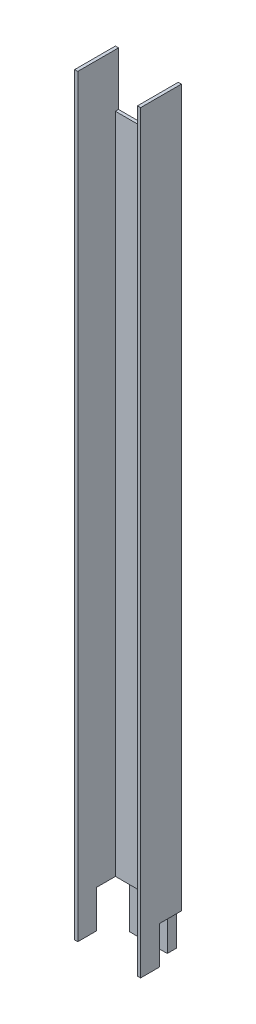
ISO-10303-21;
HEADER;
FILE_DESCRIPTION(('STEP AP214'),'2;1');
FILE_NAME('part.step','',(''),(''),'','','');
FILE_SCHEMA(('AUTOMOTIVE_DESIGN { 1 0 10303 214 1 1 1 1 }'));
ENDSEC;
DATA;
#1=APPLICATION_CONTEXT('core data for automotive mechanical design processes');
#2=APPLICATION_PROTOCOL_DEFINITION('international standard','automotive_design',2000,#1);
#3=PRODUCT_CONTEXT('',#1,'mechanical');
#4=PRODUCT('Part','Part','',(#3));
#5=PRODUCT_RELATED_PRODUCT_CATEGORY('part','',(#4));
#6=PRODUCT_DEFINITION_FORMATION('','',#4);
#7=PRODUCT_DEFINITION_CONTEXT('part definition',#1,'design');
#8=PRODUCT_DEFINITION('design','',#6,#7);
#9=PRODUCT_DEFINITION_SHAPE('','',#8);
#10=(LENGTH_UNIT() NAMED_UNIT(*) SI_UNIT(.MILLI.,.METRE.));
#11=(NAMED_UNIT(*) PLANE_ANGLE_UNIT() SI_UNIT($,.RADIAN.));
#12=(NAMED_UNIT(*) SI_UNIT($,.STERADIAN.) SOLID_ANGLE_UNIT());
#13=UNCERTAINTY_MEASURE_WITH_UNIT(LENGTH_MEASURE(1.E-05),#10,'distance_accuracy_value','');
#14=(GEOMETRIC_REPRESENTATION_CONTEXT(3) GLOBAL_UNCERTAINTY_ASSIGNED_CONTEXT((#13)) GLOBAL_UNIT_ASSIGNED_CONTEXT((#10,
#11,#12)) REPRESENTATION_CONTEXT('',''));
#15=CARTESIAN_POINT('',(0.,0.,0.));
#16=DIRECTION('',(0.,0.,1.));
#17=DIRECTION('',(1.,0.,0.));
#18=AXIS2_PLACEMENT_3D('',#15,#16,#17);
#19=CARTESIAN_POINT('',(0.,0.,0.));
#20=DIRECTION('',(0.,-1.,0.));
#21=DIRECTION('',(0.,0.,-1.));
#22=AXIS2_PLACEMENT_3D('',#19,#20,#21);
#23=PLANE('',#22);
#24=DIRECTION('',(0.,0.,1.));
#25=VECTOR('',#24,1.);
#26=CARTESIAN_POINT('',(9.5,0.,6.5));
#27=LINE('',#26,#25);
#28=CARTESIAN_POINT('',(9.50000000000001,0.,0.500000000000001));
#29=VERTEX_POINT('',#28);
#30=CARTESIAN_POINT('',(9.5,0.,6.5));
#31=VERTEX_POINT('',#30);
#32=EDGE_CURVE('E160',#29,#31,#27,.T.);
#33=ORIENTED_EDGE('',*,*,#32,.F.);
#34=DIRECTION('',(1.,0.,0.));
#35=VECTOR('',#34,1.);
#36=CARTESIAN_POINT('',(-19.5,0.,0.500000000000001));
#37=LINE('',#36,#35);
#38=CARTESIAN_POINT('',(10.5,0.,0.500000000000001));
#39=VERTEX_POINT('',#38);
#40=EDGE_CURVE('E218',#29,#39,#37,.T.);
#41=ORIENTED_EDGE('',*,*,#40,.T.);
#42=DIRECTION('',(0.,0.,-1.));
#43=VECTOR('',#42,1.);
#44=CARTESIAN_POINT('',(10.5,0.,-6.5));
#45=LINE('',#44,#43);
#46=CARTESIAN_POINT('',(10.5,0.,6.5));
#47=VERTEX_POINT('',#46);
#48=EDGE_CURVE('E148',#47,#39,#45,.T.);
#49=ORIENTED_EDGE('',*,*,#48,.F.);
#50=DIRECTION('',(1.,0.,0.));
#51=VECTOR('',#50,1.);
#52=CARTESIAN_POINT('',(10.5,0.,6.5));
#53=LINE('',#52,#51);
#54=EDGE_CURVE('E85',#31,#47,#53,.T.);
#55=ORIENTED_EDGE('',*,*,#54,.F.);
#56=EDGE_LOOP('',(#33,#41,#49,#55));
#57=FACE_BOUND('',#56,.T.);
#58=ADVANCED_FACE('F39',(#57),#23,.T.);
#59=DIRECTION('',(0.,0.,1.));
#60=VECTOR('',#59,1.);
#61=CARTESIAN_POINT('',(-10.5,0.,6.5));
#62=LINE('',#61,#60);
#63=CARTESIAN_POINT('',(-10.5,0.,0.500000000000001));
#64=VERTEX_POINT('',#63);
#65=CARTESIAN_POINT('',(-10.5,0.,6.5));
#66=VERTEX_POINT('',#65);
#67=EDGE_CURVE('E152',#64,#66,#62,.T.);
#68=ORIENTED_EDGE('',*,*,#67,.F.);
#69=CARTESIAN_POINT('',(-9.5,0.,0.500000000000001));
#70=VERTEX_POINT('',#69);
#71=EDGE_CURVE('E216',#64,#70,#37,.T.);
#72=ORIENTED_EDGE('',*,*,#71,.T.);
#73=DIRECTION('',(0.,0.,-1.));
#74=VECTOR('',#73,1.);
#75=CARTESIAN_POINT('',(-9.5,0.,-5.5));
#76=LINE('',#75,#74);
#77=CARTESIAN_POINT('',(-9.5,0.,6.5));
#78=VERTEX_POINT('',#77);
#79=EDGE_CURVE('E157',#78,#70,#76,.T.);
#80=ORIENTED_EDGE('',*,*,#79,.F.);
#81=DIRECTION('',(1.,0.,0.));
#82=VECTOR('',#81,1.);
#83=CARTESIAN_POINT('',(-9.5,0.,6.5));
#84=LINE('',#83,#82);
#85=EDGE_CURVE('E124',#66,#78,#84,.T.);
#86=ORIENTED_EDGE('',*,*,#85,.F.);
#87=EDGE_LOOP('',(#68,#72,#80,#86));
#88=FACE_BOUND('',#87,.T.);
#89=ADVANCED_FACE('F354',(#88),#23,.T.);
#90=CARTESIAN_POINT('',(-10.5,240.,-6.5));
#91=DIRECTION('',(0.,0.,1.));
#92=DIRECTION('',(1.,0.,0.));
#93=AXIS2_PLACEMENT_3D('',#90,#91,#92);
#94=PLANE('',#93);
#95=DIRECTION('',(0.,-1.,0.));
#96=VECTOR('',#95,1.);
#97=CARTESIAN_POINT('',(10.5,240.,-6.5));
#98=LINE('',#97,#96);
#99=CARTESIAN_POINT('',(10.5,240.,-6.5));
#100=VERTEX_POINT('',#99);
#101=CARTESIAN_POINT('',(10.5,12.,-6.5));
#102=VERTEX_POINT('',#101);
#103=EDGE_CURVE('E48',#100,#102,#98,.T.);
#104=ORIENTED_EDGE('',*,*,#103,.T.);
#105=DIRECTION('',(1.,0.,0.));
#106=VECTOR('',#105,1.);
#107=CARTESIAN_POINT('',(-19.5,12.,-6.5));
#108=LINE('',#107,#106);
#109=CARTESIAN_POINT('',(5.99999999999999,12.,-6.5));
#110=VERTEX_POINT('',#109);
#111=EDGE_CURVE('E191',#110,#102,#108,.T.);
#112=ORIENTED_EDGE('',*,*,#111,.F.);
#113=DIRECTION('',(0.,-1.,0.));
#114=VECTOR('',#113,1.);
#115=CARTESIAN_POINT('',(6.,41.,-6.5));
#116=LINE('',#115,#114);
#117=CARTESIAN_POINT('',(6.,41.,-6.5));
#118=VERTEX_POINT('',#117);
#119=EDGE_CURVE('E275',#118,#110,#116,.T.);
#120=ORIENTED_EDGE('',*,*,#119,.F.);
#121=DIRECTION('',(1.,0.,0.));
#122=VECTOR('',#121,1.);
#123=CARTESIAN_POINT('',(6.,41.,-6.5));
#124=LINE('',#123,#122);
#125=CARTESIAN_POINT('',(-5.99999999999999,41.,-6.5));
#126=VERTEX_POINT('',#125);
#127=EDGE_CURVE('E287',#126,#118,#124,.T.);
#128=ORIENTED_EDGE('',*,*,#127,.F.);
#129=DIRECTION('',(0.,1.,0.));
#130=VECTOR('',#129,1.);
#131=CARTESIAN_POINT('',(-5.99999999999999,41.,-6.5));
#132=LINE('',#131,#130);
#133=CARTESIAN_POINT('',(-5.99999999999999,12.,-6.5));
#134=VERTEX_POINT('',#133);
#135=EDGE_CURVE('E55',#134,#126,#132,.T.);
#136=ORIENTED_EDGE('',*,*,#135,.F.);
#137=CARTESIAN_POINT('',(-10.5,12.,-6.5));
#138=VERTEX_POINT('',#137);
#139=EDGE_CURVE('E217',#138,#134,#108,.T.);
#140=ORIENTED_EDGE('',*,*,#139,.F.);
#141=DIRECTION('',(0.,-1.,0.));
#142=VECTOR('',#141,1.);
#143=CARTESIAN_POINT('',(-10.5,240.,-6.5));
#144=LINE('',#143,#142);
#145=CARTESIAN_POINT('',(-10.5,240.,-6.5));
#146=VERTEX_POINT('',#145);
#147=EDGE_CURVE('E180',#146,#138,#144,.T.);
#148=ORIENTED_EDGE('',*,*,#147,.F.);
#149=DIRECTION('',(-1.,0.,0.));
#150=VECTOR('',#149,1.);
#151=CARTESIAN_POINT('',(-10.5,240.,-6.5));
#152=LINE('',#151,#150);
#153=CARTESIAN_POINT('',(-9.5,240.,-6.5));
#154=VERTEX_POINT('',#153);
#155=EDGE_CURVE('E323',#154,#146,#152,.T.);
#156=ORIENTED_EDGE('',*,*,#155,.F.);
#157=DIRECTION('',(0.,1.,0.));
#158=VECTOR('',#157,1.);
#159=CARTESIAN_POINT('',(-9.5,223.,-6.5));
#160=LINE('',#159,#158);
#161=CARTESIAN_POINT('',(-9.5,223.,-6.5));
#162=VERTEX_POINT('',#161);
#163=EDGE_CURVE('E136',#162,#154,#160,.T.);
#164=ORIENTED_EDGE('',*,*,#163,.F.);
#165=DIRECTION('',(-1.,0.,0.));
#166=VECTOR('',#165,1.);
#167=CARTESIAN_POINT('',(-9.5,223.,-6.5));
#168=LINE('',#167,#166);
#169=CARTESIAN_POINT('',(9.50000000000001,223.,-6.5));
#170=VERTEX_POINT('',#169);
#171=EDGE_CURVE('E308',#170,#162,#168,.T.);
#172=ORIENTED_EDGE('',*,*,#171,.F.);
#173=DIRECTION('',(0.,1.,0.));
#174=VECTOR('',#173,1.);
#175=CARTESIAN_POINT('',(9.50000000000001,223.,-6.5));
#176=LINE('',#175,#174);
#177=CARTESIAN_POINT('',(9.50000000000001,240.,-6.5));
#178=VERTEX_POINT('',#177);
#179=EDGE_CURVE('E316',#170,#178,#176,.T.);
#180=ORIENTED_EDGE('',*,*,#179,.T.);
#181=EDGE_CURVE('E94',#100,#178,#152,.T.);
#182=ORIENTED_EDGE('',*,*,#181,.F.);
#183=EDGE_LOOP('',(#104,#112,#120,#128,#136,#140,#148,#156,#164,#172,#180,#182));
#184=FACE_BOUND('',#183,.T.);
#185=ADVANCED_FACE('F187',(#184),#94,.F.);
#186=CARTESIAN_POINT('',(9.50000000000001,240.,-5.5));
#187=DIRECTION('',(0.,0.,-1.));
#188=DIRECTION('',(-1.,0.,0.));
#189=AXIS2_PLACEMENT_3D('',#186,#187,#188);
#190=PLANE('',#189);
#191=DIRECTION('',(0.,-1.,0.));
#192=VECTOR('',#191,1.);
#193=CARTESIAN_POINT('',(-9.5,240.,-5.5));
#194=LINE('',#193,#192);
#195=CARTESIAN_POINT('',(-9.5,223.,-5.5));
#196=VERTEX_POINT('',#195);
#197=CARTESIAN_POINT('',(-9.5,12.,-5.5));
#198=VERTEX_POINT('',#197);
#199=EDGE_CURVE('E130',#196,#198,#194,.T.);
#200=ORIENTED_EDGE('',*,*,#199,.T.);
#201=DIRECTION('',(1.,0.,0.));
#202=VECTOR('',#201,1.);
#203=CARTESIAN_POINT('',(9.50000000000001,12.,-5.5));
#204=LINE('',#203,#202);
#205=CARTESIAN_POINT('',(9.50000000000001,12.,-5.5));
#206=VERTEX_POINT('',#205);
#207=EDGE_CURVE('E238',#198,#206,#204,.T.);
#208=ORIENTED_EDGE('',*,*,#207,.T.);
#209=DIRECTION('',(0.,-1.,0.));
#210=VECTOR('',#209,1.);
#211=CARTESIAN_POINT('',(9.50000000000001,240.,-5.5));
#212=LINE('',#211,#210);
#213=CARTESIAN_POINT('',(9.50000000000001,223.,-5.5));
#214=VERTEX_POINT('',#213);
#215=EDGE_CURVE('E171',#214,#206,#212,.T.);
#216=ORIENTED_EDGE('',*,*,#215,.F.);
#217=DIRECTION('',(1.,0.,0.));
#218=VECTOR('',#217,1.);
#219=CARTESIAN_POINT('',(9.50000000000001,223.,-5.5));
#220=LINE('',#219,#218);
#221=EDGE_CURVE('E300',#196,#214,#220,.T.);
#222=ORIENTED_EDGE('',*,*,#221,.F.);
#223=EDGE_LOOP('',(#200,#208,#216,#222));
#224=FACE_BOUND('',#223,.T.);
#225=ADVANCED_FACE('F433',(#224),#190,.F.);
#226=CARTESIAN_POINT('',(0.,240.,0.));
#227=DIRECTION('',(0.,-1.,0.));
#228=DIRECTION('',(0.,0.,-1.));
#229=AXIS2_PLACEMENT_3D('',#226,#227,#228);
#230=PLANE('',#229);
#231=DIRECTION('',(0.,0.,-1.));
#232=VECTOR('',#231,1.);
#233=CARTESIAN_POINT('',(-9.5,240.,-5.5));
#234=LINE('',#233,#232);
#235=CARTESIAN_POINT('',(-9.5,240.,6.5));
#236=VERTEX_POINT('',#235);
#237=EDGE_CURVE('E111',#236,#154,#234,.T.);
#238=ORIENTED_EDGE('',*,*,#237,.T.);
#239=ORIENTED_EDGE('',*,*,#155,.T.);
#240=DIRECTION('',(0.,0.,1.));
#241=VECTOR('',#240,1.);
#242=CARTESIAN_POINT('',(-10.5,240.,6.5));
#243=LINE('',#242,#241);
#244=CARTESIAN_POINT('',(-10.5,240.,6.5));
#245=VERTEX_POINT('',#244);
#246=EDGE_CURVE('E114',#146,#245,#243,.T.);
#247=ORIENTED_EDGE('',*,*,#246,.T.);
#248=DIRECTION('',(1.,0.,0.));
#249=VECTOR('',#248,1.);
#250=CARTESIAN_POINT('',(-9.5,240.,6.5));
#251=LINE('',#250,#249);
#252=EDGE_CURVE('E107',#245,#236,#251,.T.);
#253=ORIENTED_EDGE('',*,*,#252,.T.);
#254=EDGE_LOOP('',(#238,#239,#247,#253));
#255=FACE_BOUND('',#254,.T.);
#256=ADVANCED_FACE('F109',(#255),#230,.F.);
#257=CARTESIAN_POINT('',(10.5,240.,-6.5));
#258=DIRECTION('',(-1.,0.,0.));
#259=DIRECTION('',(0.,0.,1.));
#260=AXIS2_PLACEMENT_3D('',#257,#258,#259);
#261=PLANE('',#260);
#262=DIRECTION('',(0.,1.,0.));
#263=VECTOR('',#262,1.);
#264=CARTESIAN_POINT('',(10.5,0.,0.500000000000001));
#265=LINE('',#264,#263);
#266=CARTESIAN_POINT('',(10.5,12.,0.500000000000001));
#267=VERTEX_POINT('',#266);
#268=EDGE_CURVE('E204',#39,#267,#265,.T.);
#269=ORIENTED_EDGE('',*,*,#268,.T.);
#270=DIRECTION('',(0.,0.,1.));
#271=VECTOR('',#270,1.);
#272=CARTESIAN_POINT('',(10.5,12.,-6.5));
#273=LINE('',#272,#271);
#274=EDGE_CURVE('E201',#102,#267,#273,.T.);
#275=ORIENTED_EDGE('',*,*,#274,.F.);
#276=ORIENTED_EDGE('',*,*,#103,.F.);
#277=DIRECTION('',(0.,0.,-1.));
#278=VECTOR('',#277,1.);
#279=CARTESIAN_POINT('',(10.5,240.,-6.5));
#280=LINE('',#279,#278);
#281=CARTESIAN_POINT('',(10.5,240.,6.5));
#282=VERTEX_POINT('',#281);
#283=EDGE_CURVE('E165',#282,#100,#280,.T.);
#284=ORIENTED_EDGE('',*,*,#283,.F.);
#285=DIRECTION('',(0.,-1.,0.));
#286=VECTOR('',#285,1.);
#287=CARTESIAN_POINT('',(10.5,240.,6.5));
#288=LINE('',#287,#286);
#289=EDGE_CURVE('E147',#282,#47,#288,.T.);
#290=ORIENTED_EDGE('',*,*,#289,.T.);
#291=ORIENTED_EDGE('',*,*,#48,.T.);
#292=EDGE_LOOP('',(#269,#275,#276,#284,#290,#291));
#293=FACE_BOUND('',#292,.T.);
#294=ADVANCED_FACE('F41',(#293),#261,.F.);
#295=CARTESIAN_POINT('',(-10.5,240.,6.5));
#296=DIRECTION('',(1.,0.,0.));
#297=DIRECTION('',(0.,0.,-1.));
#298=AXIS2_PLACEMENT_3D('',#295,#296,#297);
#299=PLANE('',#298);
#300=ORIENTED_EDGE('',*,*,#147,.T.);
#301=DIRECTION('',(0.,0.,1.));
#302=VECTOR('',#301,1.);
#303=CARTESIAN_POINT('',(-10.5,12.,6.49999999999994));
#304=LINE('',#303,#302);
#305=CARTESIAN_POINT('',(-10.5,12.,0.500000000000001));
#306=VERTEX_POINT('',#305);
#307=EDGE_CURVE('E246',#138,#306,#304,.T.);
#308=ORIENTED_EDGE('',*,*,#307,.T.);
#309=DIRECTION('',(0.,1.,0.));
#310=VECTOR('',#309,1.);
#311=CARTESIAN_POINT('',(-10.5,240.,0.500000000000001));
#312=LINE('',#311,#310);
#313=EDGE_CURVE('E234',#64,#306,#312,.T.);
#314=ORIENTED_EDGE('',*,*,#313,.F.);
#315=ORIENTED_EDGE('',*,*,#67,.T.);
#316=DIRECTION('',(0.,-1.,0.));
#317=VECTOR('',#316,1.);
#318=CARTESIAN_POINT('',(-10.5,240.,6.5));
#319=LINE('',#318,#317);
#320=EDGE_CURVE('E129',#245,#66,#319,.T.);
#321=ORIENTED_EDGE('',*,*,#320,.F.);
#322=ORIENTED_EDGE('',*,*,#246,.F.);
#323=EDGE_LOOP('',(#300,#308,#314,#315,#321,#322));
#324=FACE_BOUND('',#323,.T.);
#325=ADVANCED_FACE('F357',(#324),#299,.F.);
#326=CARTESIAN_POINT('',(-9.5,240.,6.5));
#327=DIRECTION('',(0.,0.,-1.));
#328=DIRECTION('',(-1.,0.,0.));
#329=AXIS2_PLACEMENT_3D('',#326,#327,#328);
#330=PLANE('',#329);
#331=ORIENTED_EDGE('',*,*,#85,.T.);
#332=DIRECTION('',(0.,-1.,0.));
#333=VECTOR('',#332,1.);
#334=CARTESIAN_POINT('',(-9.5,240.,6.5));
#335=LINE('',#334,#333);
#336=EDGE_CURVE('E121',#236,#78,#335,.T.);
#337=ORIENTED_EDGE('',*,*,#336,.F.);
#338=ORIENTED_EDGE('',*,*,#252,.F.);
#339=ORIENTED_EDGE('',*,*,#320,.T.);
#340=EDGE_LOOP('',(#331,#337,#338,#339));
#341=FACE_BOUND('',#340,.T.);
#342=ADVANCED_FACE('F122',(#341),#330,.F.);
#343=CARTESIAN_POINT('',(-9.5,240.,-5.5));
#344=DIRECTION('',(-1.,0.,0.));
#345=DIRECTION('',(0.,0.,1.));
#346=AXIS2_PLACEMENT_3D('',#343,#344,#345);
#347=PLANE('',#346);
#348=DIRECTION('',(0.,-1.,0.));
#349=VECTOR('',#348,1.);
#350=CARTESIAN_POINT('',(-9.5,240.,0.500000000000001));
#351=LINE('',#350,#349);
#352=CARTESIAN_POINT('',(-9.5,12.,0.500000000000001));
#353=VERTEX_POINT('',#352);
#354=EDGE_CURVE('E230',#353,#70,#351,.T.);
#355=ORIENTED_EDGE('',*,*,#354,.F.);
#356=DIRECTION('',(0.,0.,-1.));
#357=VECTOR('',#356,1.);
#358=CARTESIAN_POINT('',(-9.5,12.,-5.50000000000006));
#359=LINE('',#358,#357);
#360=EDGE_CURVE('E242',#353,#198,#359,.T.);
#361=ORIENTED_EDGE('',*,*,#360,.T.);
#362=ORIENTED_EDGE('',*,*,#199,.F.);
#363=DIRECTION('',(0.,0.,1.));
#364=VECTOR('',#363,1.);
#365=CARTESIAN_POINT('',(-9.5,223.,-5.5));
#366=LINE('',#365,#364);
#367=EDGE_CURVE('E312',#162,#196,#366,.T.);
#368=ORIENTED_EDGE('',*,*,#367,.F.);
#369=ORIENTED_EDGE('',*,*,#163,.T.);
#370=ORIENTED_EDGE('',*,*,#237,.F.);
#371=ORIENTED_EDGE('',*,*,#336,.T.);
#372=ORIENTED_EDGE('',*,*,#79,.T.);
#373=EDGE_LOOP('',(#355,#361,#362,#368,#369,#370,#371,#372));
#374=FACE_BOUND('',#373,.T.);
#375=ADVANCED_FACE('F133',(#374),#347,.F.);
#376=CARTESIAN_POINT('',(9.5,240.,6.5));
#377=DIRECTION('',(1.,0.,0.));
#378=DIRECTION('',(0.,0.,-1.));
#379=AXIS2_PLACEMENT_3D('',#376,#377,#378);
#380=PLANE('',#379);
#381=ORIENTED_EDGE('',*,*,#215,.T.);
#382=DIRECTION('',(0.,0.,1.));
#383=VECTOR('',#382,1.);
#384=CARTESIAN_POINT('',(9.5,12.,6.49999999999994));
#385=LINE('',#384,#383);
#386=CARTESIAN_POINT('',(9.50000000000001,12.,0.500000000000001));
#387=VERTEX_POINT('',#386);
#388=EDGE_CURVE('E11',#206,#387,#385,.T.);
#389=ORIENTED_EDGE('',*,*,#388,.T.);
#390=DIRECTION('',(0.,1.,0.));
#391=VECTOR('',#390,1.);
#392=CARTESIAN_POINT('',(9.5,240.,0.500000000000001));
#393=LINE('',#392,#391);
#394=EDGE_CURVE('E226',#29,#387,#393,.T.);
#395=ORIENTED_EDGE('',*,*,#394,.F.);
#396=ORIENTED_EDGE('',*,*,#32,.T.);
#397=DIRECTION('',(0.,-1.,0.));
#398=VECTOR('',#397,1.);
#399=CARTESIAN_POINT('',(9.5,240.,6.5));
#400=LINE('',#399,#398);
#401=CARTESIAN_POINT('',(9.5,240.,6.5));
#402=VERTEX_POINT('',#401);
#403=EDGE_CURVE('E168',#402,#31,#400,.T.);
#404=ORIENTED_EDGE('',*,*,#403,.F.);
#405=DIRECTION('',(0.,0.,1.));
#406=VECTOR('',#405,1.);
#407=CARTESIAN_POINT('',(9.5,240.,6.5));
#408=LINE('',#407,#406);
#409=EDGE_CURVE('E139',#178,#402,#408,.T.);
#410=ORIENTED_EDGE('',*,*,#409,.F.);
#411=ORIENTED_EDGE('',*,*,#179,.F.);
#412=DIRECTION('',(0.,0.,-1.));
#413=VECTOR('',#412,1.);
#414=CARTESIAN_POINT('',(9.50000000000001,223.,-6.5));
#415=LINE('',#414,#413);
#416=EDGE_CURVE('E304',#214,#170,#415,.T.);
#417=ORIENTED_EDGE('',*,*,#416,.F.);
#418=EDGE_LOOP('',(#381,#389,#395,#396,#404,#410,#411,#417));
#419=FACE_BOUND('',#418,.T.);
#420=ADVANCED_FACE('F417',(#419),#380,.F.);
#421=CARTESIAN_POINT('',(10.5,240.,6.5));
#422=DIRECTION('',(0.,0.,-1.));
#423=DIRECTION('',(-1.,0.,0.));
#424=AXIS2_PLACEMENT_3D('',#421,#422,#423);
#425=PLANE('',#424);
#426=ORIENTED_EDGE('',*,*,#54,.T.);
#427=ORIENTED_EDGE('',*,*,#289,.F.);
#428=DIRECTION('',(1.,0.,0.));
#429=VECTOR('',#428,1.);
#430=CARTESIAN_POINT('',(10.5,240.,6.5));
#431=LINE('',#430,#429);
#432=EDGE_CURVE('E64',#402,#282,#431,.T.);
#433=ORIENTED_EDGE('',*,*,#432,.F.);
#434=ORIENTED_EDGE('',*,*,#403,.T.);
#435=EDGE_LOOP('',(#426,#427,#433,#434));
#436=FACE_BOUND('',#435,.T.);
#437=ADVANCED_FACE('F422',(#436),#425,.F.);
#438=ORIENTED_EDGE('',*,*,#181,.T.);
#439=ORIENTED_EDGE('',*,*,#409,.T.);
#440=ORIENTED_EDGE('',*,*,#432,.T.);
#441=ORIENTED_EDGE('',*,*,#283,.T.);
#442=EDGE_LOOP('',(#438,#439,#440,#441));
#443=FACE_BOUND('',#442,.T.);
#444=ADVANCED_FACE('F419',(#443),#230,.F.);
#445=CARTESIAN_POINT('',(0.,223.,0.));
#446=DIRECTION('',(0.,-1.,0.));
#447=DIRECTION('',(0.,0.,-1.));
#448=AXIS2_PLACEMENT_3D('',#445,#446,#447);
#449=PLANE('',#448);
#450=ORIENTED_EDGE('',*,*,#221,.T.);
#451=ORIENTED_EDGE('',*,*,#416,.T.);
#452=ORIENTED_EDGE('',*,*,#171,.T.);
#453=ORIENTED_EDGE('',*,*,#367,.T.);
#454=EDGE_LOOP('',(#450,#451,#452,#453));
#455=FACE_BOUND('',#454,.T.);
#456=ADVANCED_FACE('F421',(#455),#449,.F.);
#457=CARTESIAN_POINT('',(-5.99999999999999,41.,-9.5));
#458=DIRECTION('',(1.,0.,0.));
#459=DIRECTION('',(0.,1.,0.));
#460=AXIS2_PLACEMENT_3D('',#457,#458,#459);
#461=PLANE('',#460);
#462=CARTESIAN_POINT('',(-5.99999999999999,-2.,-6.5));
#463=VERTEX_POINT('',#462);
#464=EDGE_CURVE('E284',#463,#134,#132,.T.);
#465=ORIENTED_EDGE('',*,*,#464,.T.);
#466=ORIENTED_EDGE('',*,*,#135,.T.);
#467=DIRECTION('',(0.,0.,1.));
#468=VECTOR('',#467,1.);
#469=CARTESIAN_POINT('',(-5.99999999999999,41.,-9.5));
#470=LINE('',#469,#468);
#471=CARTESIAN_POINT('',(-5.99999999999999,41.,-9.5));
#472=VERTEX_POINT('',#471);
#473=EDGE_CURVE('E296',#472,#126,#470,.T.);
#474=ORIENTED_EDGE('',*,*,#473,.F.);
#475=DIRECTION('',(0.,1.,0.));
#476=VECTOR('',#475,1.);
#477=CARTESIAN_POINT('',(-5.99999999999999,41.,-9.5));
#478=LINE('',#477,#476);
#479=CARTESIAN_POINT('',(-5.99999999999999,-2.,-9.5));
#480=VERTEX_POINT('',#479);
#481=EDGE_CURVE('E270',#480,#472,#478,.T.);
#482=ORIENTED_EDGE('',*,*,#481,.F.);
#483=DIRECTION('',(0.,0.,-1.));
#484=VECTOR('',#483,1.);
#485=CARTESIAN_POINT('',(-5.99999999999999,-2.,-9.5));
#486=LINE('',#485,#484);
#487=EDGE_CURVE('E250',#463,#480,#486,.T.);
#488=ORIENTED_EDGE('',*,*,#487,.F.);
#489=EDGE_LOOP('',(#465,#466,#474,#482,#488));
#490=FACE_BOUND('',#489,.T.);
#491=ADVANCED_FACE('F369',(#490),#461,.F.);
#492=CARTESIAN_POINT('',(6.,41.,-9.5));
#493=DIRECTION('',(0.,-1.,0.));
#494=DIRECTION('',(0.,0.,-1.));
#495=AXIS2_PLACEMENT_3D('',#492,#493,#494);
#496=PLANE('',#495);
#497=ORIENTED_EDGE('',*,*,#127,.T.);
#498=DIRECTION('',(0.,0.,1.));
#499=VECTOR('',#498,1.);
#500=CARTESIAN_POINT('',(6.,41.,-9.5));
#501=LINE('',#500,#499);
#502=CARTESIAN_POINT('',(6.,41.,-9.5));
#503=VERTEX_POINT('',#502);
#504=EDGE_CURVE('E283',#503,#118,#501,.T.);
#505=ORIENTED_EDGE('',*,*,#504,.F.);
#506=DIRECTION('',(1.,0.,0.));
#507=VECTOR('',#506,1.);
#508=CARTESIAN_POINT('',(6.,41.,-9.5));
#509=LINE('',#508,#507);
#510=EDGE_CURVE('E274',#472,#503,#509,.T.);
#511=ORIENTED_EDGE('',*,*,#510,.F.);
#512=ORIENTED_EDGE('',*,*,#473,.T.);
#513=EDGE_LOOP('',(#497,#505,#511,#512));
#514=FACE_BOUND('',#513,.T.);
#515=ADVANCED_FACE('F526',(#514),#496,.F.);
#516=CARTESIAN_POINT('',(6.,41.,-9.5));
#517=DIRECTION('',(-1.,0.,0.));
#518=DIRECTION('',(0.,-1.,0.));
#519=AXIS2_PLACEMENT_3D('',#516,#517,#518);
#520=PLANE('',#519);
#521=ORIENTED_EDGE('',*,*,#119,.T.);
#522=DIRECTION('',(0.,1.,0.));
#523=VECTOR('',#522,1.);
#524=CARTESIAN_POINT('',(6.,-2.,-6.5));
#525=LINE('',#524,#523);
#526=CARTESIAN_POINT('',(6.,-2.,-6.5));
#527=VERTEX_POINT('',#526);
#528=EDGE_CURVE('E266',#527,#110,#525,.T.);
#529=ORIENTED_EDGE('',*,*,#528,.F.);
#530=DIRECTION('',(0.,0.,1.));
#531=VECTOR('',#530,1.);
#532=CARTESIAN_POINT('',(6.,-2.,-6.5));
#533=LINE('',#532,#531);
#534=CARTESIAN_POINT('',(6.,-2.,-9.5));
#535=VERTEX_POINT('',#534);
#536=EDGE_CURVE('E258',#535,#527,#533,.T.);
#537=ORIENTED_EDGE('',*,*,#536,.F.);
#538=DIRECTION('',(0.,-1.,0.));
#539=VECTOR('',#538,1.);
#540=CARTESIAN_POINT('',(6.,41.,-9.5));
#541=LINE('',#540,#539);
#542=EDGE_CURVE('E279',#503,#535,#541,.T.);
#543=ORIENTED_EDGE('',*,*,#542,.F.);
#544=ORIENTED_EDGE('',*,*,#504,.T.);
#545=EDGE_LOOP('',(#521,#529,#537,#543,#544));
#546=FACE_BOUND('',#545,.T.);
#547=ADVANCED_FACE('F388',(#546),#520,.F.);
#548=CARTESIAN_POINT('',(0.,0.,-9.5));
#549=DIRECTION('',(0.,0.,1.));
#550=DIRECTION('',(1.,0.,0.));
#551=AXIS2_PLACEMENT_3D('',#548,#549,#550);
#552=PLANE('',#551);
#553=ORIENTED_EDGE('',*,*,#481,.T.);
#554=ORIENTED_EDGE('',*,*,#510,.T.);
#555=ORIENTED_EDGE('',*,*,#542,.T.);
#556=DIRECTION('',(1.,0.,0.));
#557=VECTOR('',#556,1.);
#558=CARTESIAN_POINT('',(6.,-2.,-9.5));
#559=LINE('',#558,#557);
#560=EDGE_CURVE('E254',#480,#535,#559,.T.);
#561=ORIENTED_EDGE('',*,*,#560,.F.);
#562=EDGE_LOOP('',(#553,#554,#555,#561));
#563=FACE_BOUND('',#562,.T.);
#564=ADVANCED_FACE('F539',(#563),#552,.F.);
#565=CARTESIAN_POINT('',(-5.99999999999999,-2.,-6.5));
#566=DIRECTION('',(0.,0.,-1.));
#567=DIRECTION('',(-1.,0.,0.));
#568=AXIS2_PLACEMENT_3D('',#565,#566,#567);
#569=PLANE('',#568);
#570=ORIENTED_EDGE('',*,*,#464,.F.);
#571=DIRECTION('',(-1.,0.,0.));
#572=VECTOR('',#571,1.);
#573=CARTESIAN_POINT('',(-5.99999999999999,-2.,-6.5));
#574=LINE('',#573,#572);
#575=EDGE_CURVE('E262',#527,#463,#574,.T.);
#576=ORIENTED_EDGE('',*,*,#575,.F.);
#577=ORIENTED_EDGE('',*,*,#528,.T.);
#578=EDGE_CURVE('E215',#134,#110,#108,.T.);
#579=ORIENTED_EDGE('',*,*,#578,.F.);
#580=EDGE_LOOP('',(#570,#576,#577,#579));
#581=FACE_BOUND('',#580,.T.);
#582=ADVANCED_FACE('F374',(#581),#569,.F.);
#583=CARTESIAN_POINT('',(0.,-2.,0.));
#584=DIRECTION('',(0.,1.,0.));
#585=DIRECTION('',(0.,0.,1.));
#586=AXIS2_PLACEMENT_3D('',#583,#584,#585);
#587=PLANE('',#586);
#588=ORIENTED_EDGE('',*,*,#487,.T.);
#589=ORIENTED_EDGE('',*,*,#560,.T.);
#590=ORIENTED_EDGE('',*,*,#536,.T.);
#591=ORIENTED_EDGE('',*,*,#575,.T.);
#592=EDGE_LOOP('',(#588,#589,#590,#591));
#593=FACE_BOUND('',#592,.T.);
#594=ADVANCED_FACE('F379',(#593),#587,.F.);
#595=CARTESIAN_POINT('',(-19.5,12.,-6.5));
#596=DIRECTION('',(0.,1.,0.));
#597=DIRECTION('',(0.,0.,1.));
#598=AXIS2_PLACEMENT_3D('',#595,#596,#597);
#599=PLANE('',#598);
#600=ORIENTED_EDGE('',*,*,#139,.T.);
#601=ORIENTED_EDGE('',*,*,#578,.T.);
#602=ORIENTED_EDGE('',*,*,#111,.T.);
#603=ORIENTED_EDGE('',*,*,#274,.T.);
#604=DIRECTION('',(1.,0.,0.));
#605=VECTOR('',#604,1.);
#606=CARTESIAN_POINT('',(-19.5,12.,0.500000000000001));
#607=LINE('',#606,#605);
#608=EDGE_CURVE('E210',#387,#267,#607,.T.);
#609=ORIENTED_EDGE('',*,*,#608,.F.);
#610=ORIENTED_EDGE('',*,*,#388,.F.);
#611=ORIENTED_EDGE('',*,*,#207,.F.);
#612=ORIENTED_EDGE('',*,*,#360,.F.);
#613=EDGE_CURVE('E222',#306,#353,#607,.T.);
#614=ORIENTED_EDGE('',*,*,#613,.F.);
#615=ORIENTED_EDGE('',*,*,#307,.F.);
#616=EDGE_LOOP('',(#600,#601,#602,#603,#609,#610,#611,#612,#614,#615));
#617=FACE_BOUND('',#616,.T.);
#618=ADVANCED_FACE('F362',(#617),#599,.F.);
#619=CARTESIAN_POINT('',(-19.5,0.,0.500000000000001));
#620=DIRECTION('',(0.,0.,-1.));
#621=DIRECTION('',(-1.,0.,0.));
#622=AXIS2_PLACEMENT_3D('',#619,#620,#621);
#623=PLANE('',#622);
#624=ORIENTED_EDGE('',*,*,#313,.T.);
#625=ORIENTED_EDGE('',*,*,#613,.T.);
#626=ORIENTED_EDGE('',*,*,#354,.T.);
#627=ORIENTED_EDGE('',*,*,#71,.F.);
#628=EDGE_LOOP('',(#624,#625,#626,#627));
#629=FACE_BOUND('',#628,.T.);
#630=ADVANCED_FACE('F339',(#629),#623,.T.);
#631=ORIENTED_EDGE('',*,*,#394,.T.);
#632=ORIENTED_EDGE('',*,*,#608,.T.);
#633=ORIENTED_EDGE('',*,*,#268,.F.);
#634=ORIENTED_EDGE('',*,*,#40,.F.);
#635=EDGE_LOOP('',(#631,#632,#633,#634));
#636=FACE_BOUND('',#635,.T.);
#637=ADVANCED_FACE('F590',(#636),#623,.T.);
#638=CLOSED_SHELL('',(#58,#89,#185,#225,#256,#294,#325,#342,#375,#420,#437,#444,#456,#491,#515,
#547,#564,#582,#594,#618,#630,#637));
#639=MANIFOLD_SOLID_BREP('B2',#638);
#640=ADVANCED_BREP_SHAPE_REPRESENTATION('',(#18,#639),#14);
#641=SHAPE_DEFINITION_REPRESENTATION(#9,#640);
ENDSEC;
END-ISO-10303-21;
